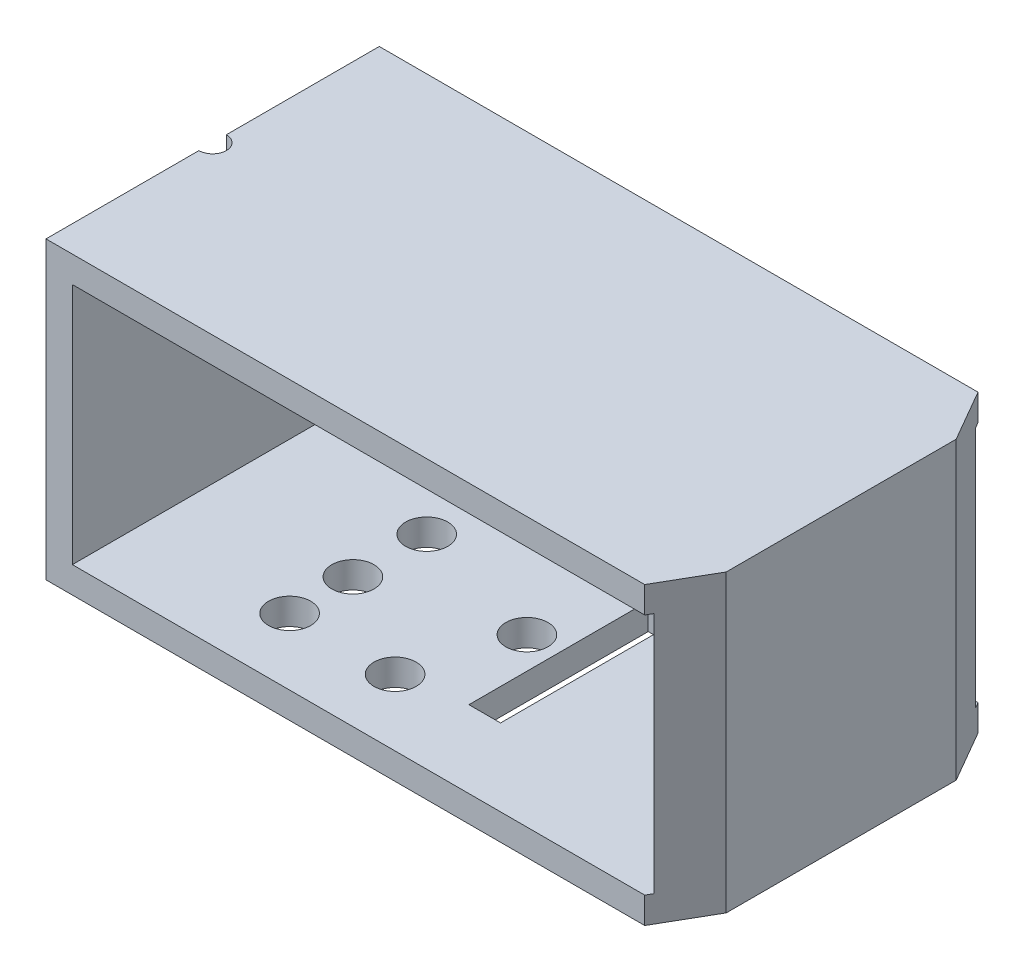
ISO-10303-21;
HEADER;
FILE_DESCRIPTION(('STEP AP214'),'2;1');
FILE_NAME('part.step','',(''),(''),'','','');
FILE_SCHEMA(('AUTOMOTIVE_DESIGN { 1 0 10303 214 1 1 1 1 }'));
ENDSEC;
DATA;
#1=APPLICATION_CONTEXT('core data for automotive mechanical design processes');
#2=APPLICATION_PROTOCOL_DEFINITION('international standard','automotive_design',2000,#1);
#3=PRODUCT_CONTEXT('',#1,'mechanical');
#4=PRODUCT('Part','Part','',(#3));
#5=PRODUCT_RELATED_PRODUCT_CATEGORY('part','',(#4));
#6=PRODUCT_DEFINITION_FORMATION('','',#4);
#7=PRODUCT_DEFINITION_CONTEXT('part definition',#1,'design');
#8=PRODUCT_DEFINITION('design','',#6,#7);
#9=PRODUCT_DEFINITION_SHAPE('','',#8);
#10=(LENGTH_UNIT() NAMED_UNIT(*) SI_UNIT(.MILLI.,.METRE.));
#11=(NAMED_UNIT(*) PLANE_ANGLE_UNIT() SI_UNIT($,.RADIAN.));
#12=(NAMED_UNIT(*) SI_UNIT($,.STERADIAN.) SOLID_ANGLE_UNIT());
#13=UNCERTAINTY_MEASURE_WITH_UNIT(LENGTH_MEASURE(1.E-05),#10,'distance_accuracy_value','');
#14=(GEOMETRIC_REPRESENTATION_CONTEXT(3) GLOBAL_UNCERTAINTY_ASSIGNED_CONTEXT((#13)) GLOBAL_UNIT_ASSIGNED_CONTEXT((#10,
#11,#12)) REPRESENTATION_CONTEXT('',''));
#15=CARTESIAN_POINT('',(0.,0.,0.));
#16=DIRECTION('',(0.,0.,1.));
#17=DIRECTION('',(1.,0.,0.));
#18=AXIS2_PLACEMENT_3D('',#15,#16,#17);
#19=CARTESIAN_POINT('',(-29.8,14.,15.8));
#20=DIRECTION('',(1.,0.,0.));
#21=DIRECTION('',(0.,0.,-1.));
#22=AXIS2_PLACEMENT_3D('',#19,#20,#21);
#23=PLANE('',#22);
#24=DIRECTION('',(0.,0.,-1.));
#25=VECTOR('',#24,1.);
#26=CARTESIAN_POINT('',(-29.8,-14.,15.8));
#27=LINE('',#26,#25);
#28=CARTESIAN_POINT('',(-29.8,-14.,-1.3));
#29=VERTEX_POINT('',#28);
#30=CARTESIAN_POINT('',(-29.8,-14.,-15.8));
#31=VERTEX_POINT('',#30);
#32=EDGE_CURVE('E290',#29,#31,#27,.T.);
#33=ORIENTED_EDGE('',*,*,#32,.F.);
#34=DIRECTION('',(0.,1.,0.));
#35=VECTOR('',#34,1.);
#36=CARTESIAN_POINT('',(-29.8,-14.,-1.3));
#37=LINE('',#36,#35);
#38=CARTESIAN_POINT('',(-29.8,14.,-1.3));
#39=VERTEX_POINT('',#38);
#40=EDGE_CURVE('E242',#29,#39,#37,.T.);
#41=ORIENTED_EDGE('',*,*,#40,.T.);
#42=DIRECTION('',(0.,0.,-1.));
#43=VECTOR('',#42,1.);
#44=CARTESIAN_POINT('',(-29.8,14.,15.8));
#45=LINE('',#44,#43);
#46=CARTESIAN_POINT('',(-29.8,14.,-15.8));
#47=VERTEX_POINT('',#46);
#48=EDGE_CURVE('E294',#39,#47,#45,.T.);
#49=ORIENTED_EDGE('',*,*,#48,.T.);
#50=DIRECTION('',(0.,-1.,0.));
#51=VECTOR('',#50,1.);
#52=CARTESIAN_POINT('',(-29.8,14.,-15.8));
#53=LINE('',#52,#51);
#54=EDGE_CURVE('E283',#47,#31,#53,.T.);
#55=ORIENTED_EDGE('',*,*,#54,.T.);
#56=EDGE_LOOP('',(#33,#41,#49,#55));
#57=FACE_BOUND('',#56,.T.);
#58=ADVANCED_FACE('F33',(#57),#23,.F.);
#59=CARTESIAN_POINT('',(0.,0.,15.8));
#60=DIRECTION('',(0.,0.,1.));
#61=DIRECTION('',(1.,0.,0.));
#62=AXIS2_PLACEMENT_3D('',#59,#60,#61);
#63=PLANE('',#62);
#64=DIRECTION('',(0.,1.,0.));
#65=VECTOR('',#64,1.);
#66=CARTESIAN_POINT('',(26.9709836809708,-14.,15.8));
#67=LINE('',#66,#65);
#68=CARTESIAN_POINT('',(26.9709836809708,11.5,15.8));
#69=VERTEX_POINT('',#68);
#70=CARTESIAN_POINT('',(26.9709836809708,14.,15.8));
#71=VERTEX_POINT('',#70);
#72=EDGE_CURVE('E215',#69,#71,#67,.T.);
#73=ORIENTED_EDGE('',*,*,#72,.T.);
#74=DIRECTION('',(-1.,0.,0.));
#75=VECTOR('',#74,1.);
#76=CARTESIAN_POINT('',(-29.8,14.,15.8));
#77=LINE('',#76,#75);
#78=CARTESIAN_POINT('',(-29.8,14.,15.8));
#79=VERTEX_POINT('',#78);
#80=EDGE_CURVE('E273',#71,#79,#77,.T.);
#81=ORIENTED_EDGE('',*,*,#80,.T.);
#82=DIRECTION('',(0.,-1.,0.));
#83=VECTOR('',#82,1.);
#84=CARTESIAN_POINT('',(-29.8,14.,15.8));
#85=LINE('',#84,#83);
#86=CARTESIAN_POINT('',(-29.8,-14.,15.8));
#87=VERTEX_POINT('',#86);
#88=EDGE_CURVE('E275',#79,#87,#85,.T.);
#89=ORIENTED_EDGE('',*,*,#88,.T.);
#90=DIRECTION('',(1.,0.,0.));
#91=VECTOR('',#90,1.);
#92=CARTESIAN_POINT('',(-29.8,-14.,15.8));
#93=LINE('',#92,#91);
#94=CARTESIAN_POINT('',(26.9709836809708,-14.,15.8));
#95=VERTEX_POINT('',#94);
#96=EDGE_CURVE('E278',#87,#95,#93,.T.);
#97=ORIENTED_EDGE('',*,*,#96,.T.);
#98=CARTESIAN_POINT('',(26.9709836809708,-11.5,15.8));
#99=VERTEX_POINT('',#98);
#100=EDGE_CURVE('E211',#95,#99,#67,.T.);
#101=ORIENTED_EDGE('',*,*,#100,.T.);
#102=DIRECTION('',(1.,0.,0.));
#103=VECTOR('',#102,1.);
#104=CARTESIAN_POINT('',(-27.3,-11.5,15.8));
#105=LINE('',#104,#103);
#106=CARTESIAN_POINT('',(-27.3,-11.5,15.8));
#107=VERTEX_POINT('',#106);
#108=EDGE_CURVE('E252',#107,#99,#105,.T.);
#109=ORIENTED_EDGE('',*,*,#108,.F.);
#110=DIRECTION('',(0.,-1.,0.));
#111=VECTOR('',#110,1.);
#112=CARTESIAN_POINT('',(-27.3,11.5,15.8));
#113=LINE('',#112,#111);
#114=CARTESIAN_POINT('',(-27.3,11.5,15.8));
#115=VERTEX_POINT('',#114);
#116=EDGE_CURVE('E248',#115,#107,#113,.T.);
#117=ORIENTED_EDGE('',*,*,#116,.F.);
#118=DIRECTION('',(-1.,0.,0.));
#119=VECTOR('',#118,1.);
#120=CARTESIAN_POINT('',(-27.3,11.5,15.8));
#121=LINE('',#120,#119);
#122=EDGE_CURVE('E246',#69,#115,#121,.T.);
#123=ORIENTED_EDGE('',*,*,#122,.F.);
#124=EDGE_LOOP('',(#73,#81,#89,#97,#101,#109,#117,#123));
#125=FACE_BOUND('',#124,.T.);
#126=ADVANCED_FACE('F375',(#125),#63,.T.);
#127=CARTESIAN_POINT('',(0.,0.,-15.8));
#128=DIRECTION('',(0.,0.,1.));
#129=DIRECTION('',(1.,0.,0.));
#130=AXIS2_PLACEMENT_3D('',#127,#128,#129);
#131=PLANE('',#130);
#132=DIRECTION('',(-1.,0.,0.));
#133=VECTOR('',#132,1.);
#134=CARTESIAN_POINT('',(-29.8,14.,-15.8));
#135=LINE('',#134,#133);
#136=CARTESIAN_POINT('',(26.9709836809708,14.,-15.8));
#137=VERTEX_POINT('',#136);
#138=EDGE_CURVE('E272',#137,#47,#135,.T.);
#139=ORIENTED_EDGE('',*,*,#138,.F.);
#140=DIRECTION('',(0.,1.,0.));
#141=VECTOR('',#140,1.);
#142=CARTESIAN_POINT('',(26.9709836809708,-14.,-15.8));
#143=LINE('',#142,#141);
#144=CARTESIAN_POINT('',(26.9709836809708,11.5,-15.8));
#145=VERTEX_POINT('',#144);
#146=EDGE_CURVE('E220',#145,#137,#143,.T.);
#147=ORIENTED_EDGE('',*,*,#146,.F.);
#148=DIRECTION('',(-1.,0.,0.));
#149=VECTOR('',#148,1.);
#150=CARTESIAN_POINT('',(-27.3,11.5,-15.8));
#151=LINE('',#150,#149);
#152=CARTESIAN_POINT('',(-27.3,11.5,-15.8));
#153=VERTEX_POINT('',#152);
#154=EDGE_CURVE('E245',#145,#153,#151,.T.);
#155=ORIENTED_EDGE('',*,*,#154,.T.);
#156=DIRECTION('',(0.,-1.,0.));
#157=VECTOR('',#156,1.);
#158=CARTESIAN_POINT('',(-27.3,11.5,-15.8));
#159=LINE('',#158,#157);
#160=CARTESIAN_POINT('',(-27.3,-11.5,-15.8));
#161=VERTEX_POINT('',#160);
#162=EDGE_CURVE('E257',#153,#161,#159,.T.);
#163=ORIENTED_EDGE('',*,*,#162,.T.);
#164=DIRECTION('',(1.,0.,0.));
#165=VECTOR('',#164,1.);
#166=CARTESIAN_POINT('',(-27.3,-11.5,-15.8));
#167=LINE('',#166,#165);
#168=CARTESIAN_POINT('',(26.9709836809708,-11.5,-15.8));
#169=VERTEX_POINT('',#168);
#170=EDGE_CURVE('E249',#161,#169,#167,.T.);
#171=ORIENTED_EDGE('',*,*,#170,.T.);
#172=CARTESIAN_POINT('',(26.9709836809708,-14.,-15.8));
#173=VERTEX_POINT('',#172);
#174=EDGE_CURVE('E225',#173,#169,#143,.T.);
#175=ORIENTED_EDGE('',*,*,#174,.F.);
#176=DIRECTION('',(1.,0.,0.));
#177=VECTOR('',#176,1.);
#178=CARTESIAN_POINT('',(-29.8,-14.,-15.8));
#179=LINE('',#178,#177);
#180=EDGE_CURVE('E276',#31,#173,#179,.T.);
#181=ORIENTED_EDGE('',*,*,#180,.F.);
#182=ORIENTED_EDGE('',*,*,#54,.F.);
#183=EDGE_LOOP('',(#139,#147,#155,#163,#171,#175,#181,#182));
#184=FACE_BOUND('',#183,.T.);
#185=ADVANCED_FACE('F406',(#184),#131,.F.);
#186=CARTESIAN_POINT('',(29.8,14.,15.8));
#187=DIRECTION('',(-1.,0.,0.));
#188=DIRECTION('',(0.,-1.,0.));
#189=AXIS2_PLACEMENT_3D('',#186,#187,#188);
#190=PLANE('',#189);
#191=DIRECTION('',(0.,0.,-1.));
#192=VECTOR('',#191,1.);
#193=CARTESIAN_POINT('',(29.8,14.,15.8));
#194=LINE('',#193,#192);
#195=CARTESIAN_POINT('',(29.8,14.,10.9));
#196=VERTEX_POINT('',#195);
#197=CARTESIAN_POINT('',(29.8,14.,-10.9));
#198=VERTEX_POINT('',#197);
#199=EDGE_CURVE('E298',#196,#198,#194,.T.);
#200=ORIENTED_EDGE('',*,*,#199,.F.);
#201=DIRECTION('',(0.,1.,0.));
#202=VECTOR('',#201,1.);
#203=CARTESIAN_POINT('',(29.8,-14.,10.9));
#204=LINE('',#203,#202);
#205=CARTESIAN_POINT('',(29.8,-14.,10.9));
#206=VERTEX_POINT('',#205);
#207=EDGE_CURVE('E207',#206,#196,#204,.T.);
#208=ORIENTED_EDGE('',*,*,#207,.F.);
#209=DIRECTION('',(0.,0.,-1.));
#210=VECTOR('',#209,1.);
#211=CARTESIAN_POINT('',(29.8,-14.,15.8));
#212=LINE('',#211,#210);
#213=CARTESIAN_POINT('',(29.8,-14.,-10.9));
#214=VERTEX_POINT('',#213);
#215=EDGE_CURVE('E281',#206,#214,#212,.T.);
#216=ORIENTED_EDGE('',*,*,#215,.T.);
#217=DIRECTION('',(0.,1.,0.));
#218=VECTOR('',#217,1.);
#219=CARTESIAN_POINT('',(29.8,-14.,-10.9));
#220=LINE('',#219,#218);
#221=EDGE_CURVE('E210',#214,#198,#220,.T.);
#222=ORIENTED_EDGE('',*,*,#221,.T.);
#223=EDGE_LOOP('',(#200,#208,#216,#222));
#224=FACE_BOUND('',#223,.T.);
#225=ADVANCED_FACE('F35',(#224),#190,.F.);
#226=CARTESIAN_POINT('',(-29.8,14.,15.8));
#227=DIRECTION('',(0.,-1.,0.));
#228=DIRECTION('',(1.,0.,0.));
#229=AXIS2_PLACEMENT_3D('',#226,#227,#228);
#230=PLANE('',#229);
#231=ORIENTED_EDGE('',*,*,#80,.F.);
#232=DIRECTION('',(-0.500000000000005,0.,0.866025403784436));
#233=VECTOR('',#232,1.);
#234=CARTESIAN_POINT('',(26.9709836809708,14.,15.8));
#235=LINE('',#234,#233);
#236=EDGE_CURVE('E208',#196,#71,#235,.T.);
#237=ORIENTED_EDGE('',*,*,#236,.F.);
#238=ORIENTED_EDGE('',*,*,#199,.T.);
#239=DIRECTION('',(0.500000000000005,0.,0.866025403784436));
#240=VECTOR('',#239,1.);
#241=CARTESIAN_POINT('',(26.9709836809708,14.,-15.8));
#242=LINE('',#241,#240);
#243=EDGE_CURVE('E221',#137,#198,#242,.T.);
#244=ORIENTED_EDGE('',*,*,#243,.F.);
#245=ORIENTED_EDGE('',*,*,#138,.T.);
#246=ORIENTED_EDGE('',*,*,#48,.F.);
#247=CARTESIAN_POINT('',(-29.8,14.,0.));
#248=DIRECTION('',(0.,1.,0.));
#249=DIRECTION('',(-1.,0.,0.));
#250=AXIS2_PLACEMENT_3D('',#247,#248,#249);
#251=CIRCLE('',#250,1.3);
#252=CARTESIAN_POINT('',(-29.8,14.,1.3));
#253=VERTEX_POINT('',#252);
#254=EDGE_CURVE('E234',#253,#39,#251,.T.);
#255=ORIENTED_EDGE('',*,*,#254,.F.);
#256=EDGE_CURVE('E295',#79,#253,#45,.T.);
#257=ORIENTED_EDGE('',*,*,#256,.F.);
#258=EDGE_LOOP('',(#231,#237,#238,#244,#245,#246,#255,#257));
#259=FACE_BOUND('',#258,.T.);
#260=ADVANCED_FACE('F369',(#259),#230,.F.);
#261=ORIENTED_EDGE('',*,*,#256,.T.);
#262=DIRECTION('',(0.,1.,0.));
#263=VECTOR('',#262,1.);
#264=CARTESIAN_POINT('',(-29.8,-14.,1.3));
#265=LINE('',#264,#263);
#266=CARTESIAN_POINT('',(-29.8,-14.,1.3));
#267=VERTEX_POINT('',#266);
#268=EDGE_CURVE('E238',#253,#267,#265,.F.);
#269=ORIENTED_EDGE('',*,*,#268,.T.);
#270=EDGE_CURVE('E291',#87,#267,#27,.T.);
#271=ORIENTED_EDGE('',*,*,#270,.F.);
#272=ORIENTED_EDGE('',*,*,#88,.F.);
#273=EDGE_LOOP('',(#261,#269,#271,#272));
#274=FACE_BOUND('',#273,.T.);
#275=ADVANCED_FACE('F346',(#274),#23,.F.);
#276=CARTESIAN_POINT('',(-29.8,-14.,15.8));
#277=DIRECTION('',(0.,1.,0.));
#278=DIRECTION('',(0.,0.,1.));
#279=AXIS2_PLACEMENT_3D('',#276,#277,#278);
#280=PLANE('',#279);
#281=DIRECTION('',(-1.,0.,0.));
#282=VECTOR('',#281,1.);
#283=CARTESIAN_POINT('',(3.,-14.,8.5));
#284=LINE('',#283,#282);
#285=CARTESIAN_POINT('',(6.,-14.,8.5));
#286=VERTEX_POINT('',#285);
#287=CARTESIAN_POINT('',(3.,-14.,8.5));
#288=VERTEX_POINT('',#287);
#289=EDGE_CURVE('E169',#286,#288,#284,.T.);
#290=ORIENTED_EDGE('',*,*,#289,.F.);
#291=DIRECTION('',(0.,0.,1.));
#292=VECTOR('',#291,1.);
#293=CARTESIAN_POINT('',(6.,-14.,8.5));
#294=LINE('',#293,#292);
#295=CARTESIAN_POINT('',(6.,-14.,-8.5));
#296=VERTEX_POINT('',#295);
#297=EDGE_CURVE('E48',#296,#286,#294,.T.);
#298=ORIENTED_EDGE('',*,*,#297,.F.);
#299=DIRECTION('',(1.,0.,0.));
#300=VECTOR('',#299,1.);
#301=CARTESIAN_POINT('',(3.,-14.,-8.5));
#302=LINE('',#301,#300);
#303=CARTESIAN_POINT('',(3.,-14.,-8.5));
#304=VERTEX_POINT('',#303);
#305=EDGE_CURVE('E176',#304,#296,#302,.T.);
#306=ORIENTED_EDGE('',*,*,#305,.F.);
#307=DIRECTION('',(0.,0.,-1.));
#308=VECTOR('',#307,1.);
#309=CARTESIAN_POINT('',(3.,-14.,8.5));
#310=LINE('',#309,#308);
#311=EDGE_CURVE('E160',#288,#304,#310,.T.);
#312=ORIENTED_EDGE('',*,*,#311,.F.);
#313=EDGE_LOOP('',(#290,#298,#306,#312));
#314=FACE_BOUND('',#313,.T.);
#315=CARTESIAN_POINT('',(-13.,-14.,-3.5));
#316=DIRECTION('',(0.,-1.,0.));
#317=DIRECTION('',(0.,0.,1.));
#318=AXIS2_PLACEMENT_3D('',#315,#316,#317);
#319=CIRCLE('',#318,2.);
#320=CARTESIAN_POINT('',(-13.,-14.,-1.5));
#321=VERTEX_POINT('',#320);
#322=EDGE_CURVE('E186',#321,#321,#319,.T.);
#323=ORIENTED_EDGE('',*,*,#322,.F.);
#324=EDGE_LOOP('',(#323));
#325=FACE_BOUND('',#324,.T.);
#326=CARTESIAN_POINT('',(-13.,-14.,-9.49999999999999));
#327=DIRECTION('',(0.,-1.,0.));
#328=DIRECTION('',(0.,0.,1.));
#329=AXIS2_PLACEMENT_3D('',#326,#327,#328);
#330=CIRCLE('',#329,2.);
#331=CARTESIAN_POINT('',(-13.,-14.,-7.49999999999999));
#332=VERTEX_POINT('',#331);
#333=EDGE_CURVE('E189',#332,#332,#330,.T.);
#334=ORIENTED_EDGE('',*,*,#333,.F.);
#335=EDGE_LOOP('',(#334));
#336=FACE_BOUND('',#335,.T.);
#337=CARTESIAN_POINT('',(-3.,-14.,-9.5));
#338=DIRECTION('',(0.,-1.,0.));
#339=DIRECTION('',(0.,0.,1.));
#340=AXIS2_PLACEMENT_3D('',#337,#338,#339);
#341=CIRCLE('',#340,2.);
#342=CARTESIAN_POINT('',(-3.,-14.,-7.5));
#343=VERTEX_POINT('',#342);
#344=EDGE_CURVE('E335',#343,#343,#341,.T.);
#345=ORIENTED_EDGE('',*,*,#344,.F.);
#346=EDGE_LOOP('',(#345));
#347=FACE_BOUND('',#346,.T.);
#348=CARTESIAN_POINT('',(-13.,-14.,3.5));
#349=DIRECTION('',(0.,-1.,0.));
#350=DIRECTION('',(0.,0.,-1.));
#351=AXIS2_PLACEMENT_3D('',#348,#349,#350);
#352=CIRCLE('',#351,2.);
#353=CARTESIAN_POINT('',(-13.,-14.,1.5));
#354=VERTEX_POINT('',#353);
#355=EDGE_CURVE('E183',#354,#354,#352,.T.);
#356=ORIENTED_EDGE('',*,*,#355,.F.);
#357=EDGE_LOOP('',(#356));
#358=FACE_BOUND('',#357,.T.);
#359=CARTESIAN_POINT('',(-13.,-14.,9.49999999999999));
#360=DIRECTION('',(0.,-1.,0.));
#361=DIRECTION('',(0.,0.,-1.));
#362=AXIS2_PLACEMENT_3D('',#359,#360,#361);
#363=CIRCLE('',#362,2.);
#364=CARTESIAN_POINT('',(-13.,-14.,7.49999999999999));
#365=VERTEX_POINT('',#364);
#366=EDGE_CURVE('E194',#365,#365,#363,.T.);
#367=ORIENTED_EDGE('',*,*,#366,.F.);
#368=EDGE_LOOP('',(#367));
#369=FACE_BOUND('',#368,.T.);
#370=CARTESIAN_POINT('',(-3.,-14.,9.5));
#371=DIRECTION('',(0.,-1.,0.));
#372=DIRECTION('',(0.,0.,-1.));
#373=AXIS2_PLACEMENT_3D('',#370,#371,#372);
#374=CIRCLE('',#373,2.);
#375=CARTESIAN_POINT('',(-3.,-14.,7.5));
#376=VERTEX_POINT('',#375);
#377=EDGE_CURVE('E190',#376,#376,#374,.T.);
#378=ORIENTED_EDGE('',*,*,#377,.F.);
#379=EDGE_LOOP('',(#378));
#380=FACE_BOUND('',#379,.T.);
#381=CARTESIAN_POINT('',(0.,-14.,0.));
#382=DIRECTION('',(0.,-1.,0.));
#383=DIRECTION('',(0.,0.,-1.));
#384=AXIS2_PLACEMENT_3D('',#381,#382,#383);
#385=CIRCLE('',#384,2.);
#386=CARTESIAN_POINT('',(0.,-14.,-2.));
#387=VERTEX_POINT('',#386);
#388=EDGE_CURVE('E199',#387,#387,#385,.T.);
#389=ORIENTED_EDGE('',*,*,#388,.F.);
#390=EDGE_LOOP('',(#389));
#391=FACE_BOUND('',#390,.T.);
#392=ORIENTED_EDGE('',*,*,#215,.F.);
#393=DIRECTION('',(-0.500000000000005,0.,0.866025403784436));
#394=VECTOR('',#393,1.);
#395=CARTESIAN_POINT('',(26.9709836809708,-14.,15.8));
#396=LINE('',#395,#394);
#397=EDGE_CURVE('E204',#206,#95,#396,.T.);
#398=ORIENTED_EDGE('',*,*,#397,.T.);
#399=ORIENTED_EDGE('',*,*,#96,.F.);
#400=ORIENTED_EDGE('',*,*,#270,.T.);
#401=CARTESIAN_POINT('',(-29.8,-14.,0.));
#402=DIRECTION('',(0.,1.,0.));
#403=DIRECTION('',(-1.,0.,0.));
#404=AXIS2_PLACEMENT_3D('',#401,#402,#403);
#405=CIRCLE('',#404,1.3);
#406=EDGE_CURVE('E235',#267,#29,#405,.T.);
#407=ORIENTED_EDGE('',*,*,#406,.T.);
#408=ORIENTED_EDGE('',*,*,#32,.T.);
#409=ORIENTED_EDGE('',*,*,#180,.T.);
#410=DIRECTION('',(0.500000000000005,0.,0.866025403784436));
#411=VECTOR('',#410,1.);
#412=CARTESIAN_POINT('',(26.9709836809708,-14.,-15.8));
#413=LINE('',#412,#411);
#414=EDGE_CURVE('E217',#173,#214,#413,.T.);
#415=ORIENTED_EDGE('',*,*,#414,.T.);
#416=EDGE_LOOP('',(#392,#398,#399,#400,#407,#408,#409,#415));
#417=FACE_BOUND('',#416,.T.);
#418=ADVANCED_FACE('F173',(#314,#325,#336,#347,#358,#369,#380,#391,#417),#280,.F.);
#419=CARTESIAN_POINT('',(27.3,11.5,15.8));
#420=DIRECTION('',(-1.,0.,0.));
#421=DIRECTION('',(0.,0.,1.));
#422=AXIS2_PLACEMENT_3D('',#419,#420,#421);
#423=PLANE('',#422);
#424=DIRECTION('',(0.,-1.,0.));
#425=VECTOR('',#424,1.);
#426=CARTESIAN_POINT('',(27.3,11.5,15.2301270189222));
#427=LINE('',#426,#425);
#428=CARTESIAN_POINT('',(27.3,11.5,15.2301270189222));
#429=VERTEX_POINT('',#428);
#430=CARTESIAN_POINT('',(27.3,-11.5,15.2301270189221));
#431=VERTEX_POINT('',#430);
#432=EDGE_CURVE('E230',#429,#431,#427,.T.);
#433=ORIENTED_EDGE('',*,*,#432,.F.);
#434=DIRECTION('',(0.,0.,-1.));
#435=VECTOR('',#434,1.);
#436=CARTESIAN_POINT('',(27.3,11.5,15.8));
#437=LINE('',#436,#435);
#438=CARTESIAN_POINT('',(27.3,11.5,-15.2301270189221));
#439=VERTEX_POINT('',#438);
#440=EDGE_CURVE('E269',#429,#439,#437,.T.);
#441=ORIENTED_EDGE('',*,*,#440,.T.);
#442=DIRECTION('',(0.,1.,0.));
#443=VECTOR('',#442,1.);
#444=CARTESIAN_POINT('',(27.3,11.5,-15.2301270189221));
#445=LINE('',#444,#443);
#446=CARTESIAN_POINT('',(27.3,-11.5,-15.2301270189222));
#447=VERTEX_POINT('',#446);
#448=EDGE_CURVE('E214',#447,#439,#445,.T.);
#449=ORIENTED_EDGE('',*,*,#448,.F.);
#450=DIRECTION('',(0.,0.,-1.));
#451=VECTOR('',#450,1.);
#452=CARTESIAN_POINT('',(27.3,-11.5,15.8));
#453=LINE('',#452,#451);
#454=EDGE_CURVE('E255',#431,#447,#453,.T.);
#455=ORIENTED_EDGE('',*,*,#454,.F.);
#456=EDGE_LOOP('',(#433,#441,#449,#455));
#457=FACE_BOUND('',#456,.T.);
#458=ADVANCED_FACE('F345',(#457),#423,.T.);
#459=CARTESIAN_POINT('',(-27.3,11.5,15.8));
#460=DIRECTION('',(0.,-1.,0.));
#461=DIRECTION('',(0.,0.,-1.));
#462=AXIS2_PLACEMENT_3D('',#459,#460,#461);
#463=PLANE('',#462);
#464=DIRECTION('',(0.500000000000005,0.,-0.866025403784436));
#465=VECTOR('',#464,1.);
#466=CARTESIAN_POINT('',(13.4032377607278,11.5,39.3000252780459));
#467=LINE('',#466,#465);
#468=EDGE_CURVE('E232',#69,#429,#467,.T.);
#469=ORIENTED_EDGE('',*,*,#468,.F.);
#470=ORIENTED_EDGE('',*,*,#122,.T.);
#471=DIRECTION('',(0.,0.,-1.));
#472=VECTOR('',#471,1.);
#473=CARTESIAN_POINT('',(-27.3,11.5,15.8));
#474=LINE('',#473,#472);
#475=EDGE_CURVE('E266',#115,#153,#474,.T.);
#476=ORIENTED_EDGE('',*,*,#475,.T.);
#477=ORIENTED_EDGE('',*,*,#154,.F.);
#478=DIRECTION('',(-0.500000000000005,0.,-0.866025403784436));
#479=VECTOR('',#478,1.);
#480=CARTESIAN_POINT('',(27.0864391405221,11.5,-15.600025278046));
#481=LINE('',#480,#479);
#482=EDGE_CURVE('E228',#439,#145,#481,.T.);
#483=ORIENTED_EDGE('',*,*,#482,.F.);
#484=ORIENTED_EDGE('',*,*,#440,.F.);
#485=EDGE_LOOP('',(#469,#470,#476,#477,#483,#484));
#486=FACE_BOUND('',#485,.T.);
#487=ADVANCED_FACE('F383',(#486),#463,.T.);
#488=CARTESIAN_POINT('',(-27.3,11.5,15.8));
#489=DIRECTION('',(1.,0.,0.));
#490=DIRECTION('',(0.,1.,0.));
#491=AXIS2_PLACEMENT_3D('',#488,#489,#490);
#492=PLANE('',#491);
#493=ORIENTED_EDGE('',*,*,#162,.F.);
#494=ORIENTED_EDGE('',*,*,#475,.F.);
#495=ORIENTED_EDGE('',*,*,#116,.T.);
#496=DIRECTION('',(0.,0.,-1.));
#497=VECTOR('',#496,1.);
#498=CARTESIAN_POINT('',(-27.3,-11.5,15.8));
#499=LINE('',#498,#497);
#500=EDGE_CURVE('E264',#107,#161,#499,.T.);
#501=ORIENTED_EDGE('',*,*,#500,.T.);
#502=EDGE_LOOP('',(#493,#494,#495,#501));
#503=FACE_BOUND('',#502,.T.);
#504=ADVANCED_FACE('F413',(#503),#492,.T.);
#505=CARTESIAN_POINT('',(-27.3,-11.5,15.8));
#506=DIRECTION('',(0.,1.,0.));
#507=DIRECTION('',(0.,0.,1.));
#508=AXIS2_PLACEMENT_3D('',#505,#506,#507);
#509=PLANE('',#508);
#510=DIRECTION('',(0.,0.,-1.));
#511=VECTOR('',#510,1.);
#512=CARTESIAN_POINT('',(6.00000000000001,-11.5,15.8));
#513=LINE('',#512,#511);
#514=CARTESIAN_POINT('',(6.,-11.5,8.5));
#515=VERTEX_POINT('',#514);
#516=CARTESIAN_POINT('',(6.,-11.5,-8.5));
#517=VERTEX_POINT('',#516);
#518=EDGE_CURVE('E11',#515,#517,#513,.T.);
#519=ORIENTED_EDGE('',*,*,#518,.F.);
#520=DIRECTION('',(1.,0.,0.));
#521=VECTOR('',#520,1.);
#522=CARTESIAN_POINT('',(-27.3,-11.5,8.5));
#523=LINE('',#522,#521);
#524=CARTESIAN_POINT('',(3.,-11.5,8.5));
#525=VERTEX_POINT('',#524);
#526=EDGE_CURVE('E305',#525,#515,#523,.T.);
#527=ORIENTED_EDGE('',*,*,#526,.F.);
#528=DIRECTION('',(0.,0.,1.));
#529=VECTOR('',#528,1.);
#530=CARTESIAN_POINT('',(3.,-11.5,15.8));
#531=LINE('',#530,#529);
#532=CARTESIAN_POINT('',(3.,-11.5,-8.5));
#533=VERTEX_POINT('',#532);
#534=EDGE_CURVE('E163',#533,#525,#531,.T.);
#535=ORIENTED_EDGE('',*,*,#534,.F.);
#536=DIRECTION('',(-1.,0.,0.));
#537=VECTOR('',#536,1.);
#538=CARTESIAN_POINT('',(-27.3,-11.5,-8.5));
#539=LINE('',#538,#537);
#540=EDGE_CURVE('E41',#517,#533,#539,.T.);
#541=ORIENTED_EDGE('',*,*,#540,.F.);
#542=EDGE_LOOP('',(#519,#527,#535,#541));
#543=FACE_BOUND('',#542,.T.);
#544=CARTESIAN_POINT('',(-13.,-11.5,-3.5));
#545=DIRECTION('',(0.,1.,0.));
#546=DIRECTION('',(0.,0.,1.));
#547=AXIS2_PLACEMENT_3D('',#544,#545,#546);
#548=CIRCLE('',#547,2.);
#549=CARTESIAN_POINT('',(-13.,-11.5,-1.5));
#550=VERTEX_POINT('',#549);
#551=EDGE_CURVE('E203',#550,#550,#548,.T.);
#552=ORIENTED_EDGE('',*,*,#551,.F.);
#553=EDGE_LOOP('',(#552));
#554=FACE_BOUND('',#553,.T.);
#555=CARTESIAN_POINT('',(-13.,-11.5,-9.49999999999999));
#556=DIRECTION('',(0.,1.,0.));
#557=DIRECTION('',(0.,0.,1.));
#558=AXIS2_PLACEMENT_3D('',#555,#556,#557);
#559=CIRCLE('',#558,2.);
#560=CARTESIAN_POINT('',(-13.,-11.5,-7.49999999999999));
#561=VERTEX_POINT('',#560);
#562=EDGE_CURVE('E319',#561,#561,#559,.T.);
#563=ORIENTED_EDGE('',*,*,#562,.F.);
#564=EDGE_LOOP('',(#563));
#565=FACE_BOUND('',#564,.T.);
#566=CARTESIAN_POINT('',(-3.,-11.5,-9.5));
#567=DIRECTION('',(0.,1.,0.));
#568=DIRECTION('',(0.,0.,1.));
#569=AXIS2_PLACEMENT_3D('',#566,#567,#568);
#570=CIRCLE('',#569,2.);
#571=CARTESIAN_POINT('',(-3.,-11.5,-7.5));
#572=VERTEX_POINT('',#571);
#573=EDGE_CURVE('E316',#572,#572,#570,.T.);
#574=ORIENTED_EDGE('',*,*,#573,.F.);
#575=EDGE_LOOP('',(#574));
#576=FACE_BOUND('',#575,.T.);
#577=CARTESIAN_POINT('',(-13.,-11.5,3.5));
#578=DIRECTION('',(0.,1.,0.));
#579=DIRECTION('',(0.,0.,1.));
#580=AXIS2_PLACEMENT_3D('',#577,#578,#579);
#581=CIRCLE('',#580,2.);
#582=CARTESIAN_POINT('',(-13.,-11.5,5.5));
#583=VERTEX_POINT('',#582);
#584=EDGE_CURVE('E313',#583,#583,#581,.T.);
#585=ORIENTED_EDGE('',*,*,#584,.F.);
#586=EDGE_LOOP('',(#585));
#587=FACE_BOUND('',#586,.T.);
#588=CARTESIAN_POINT('',(-13.,-11.5,9.49999999999999));
#589=DIRECTION('',(0.,1.,0.));
#590=DIRECTION('',(0.,0.,1.));
#591=AXIS2_PLACEMENT_3D('',#588,#589,#590);
#592=CIRCLE('',#591,2.);
#593=CARTESIAN_POINT('',(-13.,-11.5,11.5));
#594=VERTEX_POINT('',#593);
#595=EDGE_CURVE('E310',#594,#594,#592,.T.);
#596=ORIENTED_EDGE('',*,*,#595,.F.);
#597=EDGE_LOOP('',(#596));
#598=FACE_BOUND('',#597,.T.);
#599=CARTESIAN_POINT('',(-3.,-11.5,9.5));
#600=DIRECTION('',(0.,1.,0.));
#601=DIRECTION('',(0.,0.,1.));
#602=AXIS2_PLACEMENT_3D('',#599,#600,#601);
#603=CIRCLE('',#602,2.);
#604=CARTESIAN_POINT('',(-3.,-11.5,11.5));
#605=VERTEX_POINT('',#604);
#606=EDGE_CURVE('E193',#605,#605,#603,.T.);
#607=ORIENTED_EDGE('',*,*,#606,.F.);
#608=EDGE_LOOP('',(#607));
#609=FACE_BOUND('',#608,.T.);
#610=CARTESIAN_POINT('',(0.,-11.5,0.));
#611=DIRECTION('',(0.,1.,0.));
#612=DIRECTION('',(0.,0.,1.));
#613=AXIS2_PLACEMENT_3D('',#610,#611,#612);
#614=CIRCLE('',#613,2.);
#615=CARTESIAN_POINT('',(0.,-11.5,2.));
#616=VERTEX_POINT('',#615);
#617=EDGE_CURVE('E202',#616,#616,#614,.T.);
#618=ORIENTED_EDGE('',*,*,#617,.F.);
#619=EDGE_LOOP('',(#618));
#620=FACE_BOUND('',#619,.T.);
#621=DIRECTION('',(-0.500000000000005,0.,0.866025403784436));
#622=VECTOR('',#621,1.);
#623=CARTESIAN_POINT('',(13.4032377607278,-11.5,39.3000252780459));
#624=LINE('',#623,#622);
#625=EDGE_CURVE('E303',#431,#99,#624,.T.);
#626=ORIENTED_EDGE('',*,*,#625,.F.);
#627=ORIENTED_EDGE('',*,*,#454,.T.);
#628=DIRECTION('',(0.500000000000005,0.,0.866025403784436));
#629=VECTOR('',#628,1.);
#630=CARTESIAN_POINT('',(27.0864391405221,-11.5,-15.600025278046));
#631=LINE('',#630,#629);
#632=EDGE_CURVE('E301',#169,#447,#631,.T.);
#633=ORIENTED_EDGE('',*,*,#632,.F.);
#634=ORIENTED_EDGE('',*,*,#170,.F.);
#635=ORIENTED_EDGE('',*,*,#500,.F.);
#636=ORIENTED_EDGE('',*,*,#108,.T.);
#637=EDGE_LOOP('',(#626,#627,#633,#634,#635,#636));
#638=FACE_BOUND('',#637,.T.);
#639=ADVANCED_FACE('F331',(#543,#554,#565,#576,#587,#598,#609,#620,#638),#509,.T.);
#640=CARTESIAN_POINT('',(-29.8,-14.,0.));
#641=DIRECTION('',(0.,1.,0.));
#642=DIRECTION('',(-1.,0.,0.));
#643=AXIS2_PLACEMENT_3D('',#640,#641,#642);
#644=CYLINDRICAL_SURFACE('',#643,1.3);
#645=ORIENTED_EDGE('',*,*,#406,.F.);
#646=ORIENTED_EDGE('',*,*,#268,.F.);
#647=ORIENTED_EDGE('',*,*,#254,.T.);
#648=ORIENTED_EDGE('',*,*,#40,.F.);
#649=EDGE_LOOP('',(#645,#646,#647,#648));
#650=FACE_BOUND('',#649,.T.);
#651=ADVANCED_FACE('F398',(#650),#644,.F.);
#652=CARTESIAN_POINT('',(26.9709836809708,-14.,-15.8));
#653=DIRECTION('',(-0.866025403784436,0.,0.500000000000005));
#654=DIRECTION('',(0.500000000000005,0.,0.866025403784436));
#655=AXIS2_PLACEMENT_3D('',#652,#653,#654);
#656=PLANE('',#655);
#657=ORIENTED_EDGE('',*,*,#482,.T.);
#658=ORIENTED_EDGE('',*,*,#146,.T.);
#659=ORIENTED_EDGE('',*,*,#243,.T.);
#660=ORIENTED_EDGE('',*,*,#221,.F.);
#661=ORIENTED_EDGE('',*,*,#414,.F.);
#662=ORIENTED_EDGE('',*,*,#174,.T.);
#663=ORIENTED_EDGE('',*,*,#632,.T.);
#664=ORIENTED_EDGE('',*,*,#448,.T.);
#665=EDGE_LOOP('',(#657,#658,#659,#660,#661,#662,#663,#664));
#666=FACE_BOUND('',#665,.T.);
#667=ADVANCED_FACE('F410',(#666),#656,.F.);
#668=CARTESIAN_POINT('',(26.9709836809708,-14.,15.8));
#669=DIRECTION('',(-0.866025403784436,0.,-0.500000000000005));
#670=DIRECTION('',(-0.500000000000005,0.,0.866025403784436));
#671=AXIS2_PLACEMENT_3D('',#668,#669,#670);
#672=PLANE('',#671);
#673=ORIENTED_EDGE('',*,*,#468,.T.);
#674=ORIENTED_EDGE('',*,*,#432,.T.);
#675=ORIENTED_EDGE('',*,*,#625,.T.);
#676=ORIENTED_EDGE('',*,*,#100,.F.);
#677=ORIENTED_EDGE('',*,*,#397,.F.);
#678=ORIENTED_EDGE('',*,*,#207,.T.);
#679=ORIENTED_EDGE('',*,*,#236,.T.);
#680=ORIENTED_EDGE('',*,*,#72,.F.);
#681=EDGE_LOOP('',(#673,#674,#675,#676,#677,#678,#679,#680));
#682=FACE_BOUND('',#681,.T.);
#683=ADVANCED_FACE('F365',(#682),#672,.F.);
#684=CARTESIAN_POINT('',(0.,-10.4,0.));
#685=DIRECTION('',(0.,-1.,0.));
#686=DIRECTION('',(0.,0.,-1.));
#687=AXIS2_PLACEMENT_3D('',#684,#685,#686);
#688=CYLINDRICAL_SURFACE('',#687,2.);
#689=ORIENTED_EDGE('',*,*,#617,.T.);
#690=EDGE_LOOP('',(#689));
#691=FACE_BOUND('',#690,.T.);
#692=ORIENTED_EDGE('',*,*,#388,.T.);
#693=EDGE_LOOP('',(#692));
#694=FACE_BOUND('',#693,.T.);
#695=ADVANCED_FACE('F477',(#691,#694),#688,.F.);
#696=CARTESIAN_POINT('',(-3.,-10.4,9.5));
#697=DIRECTION('',(0.,-1.,0.));
#698=DIRECTION('',(0.,0.,-1.));
#699=AXIS2_PLACEMENT_3D('',#696,#697,#698);
#700=CYLINDRICAL_SURFACE('',#699,2.);
#701=ORIENTED_EDGE('',*,*,#606,.T.);
#702=EDGE_LOOP('',(#701));
#703=FACE_BOUND('',#702,.T.);
#704=ORIENTED_EDGE('',*,*,#377,.T.);
#705=EDGE_LOOP('',(#704));
#706=FACE_BOUND('',#705,.T.);
#707=ADVANCED_FACE('F498',(#703,#706),#700,.F.);
#708=CARTESIAN_POINT('',(-13.,-10.4,9.49999999999999));
#709=DIRECTION('',(0.,-1.,0.));
#710=DIRECTION('',(0.,0.,-1.));
#711=AXIS2_PLACEMENT_3D('',#708,#709,#710);
#712=CYLINDRICAL_SURFACE('',#711,2.);
#713=ORIENTED_EDGE('',*,*,#595,.T.);
#714=EDGE_LOOP('',(#713));
#715=FACE_BOUND('',#714,.T.);
#716=ORIENTED_EDGE('',*,*,#366,.T.);
#717=EDGE_LOOP('',(#716));
#718=FACE_BOUND('',#717,.T.);
#719=ADVANCED_FACE('F508',(#715,#718),#712,.F.);
#720=CARTESIAN_POINT('',(-13.,-10.4,3.5));
#721=DIRECTION('',(0.,-1.,0.));
#722=DIRECTION('',(0.,0.,-1.));
#723=AXIS2_PLACEMENT_3D('',#720,#721,#722);
#724=CYLINDRICAL_SURFACE('',#723,2.);
#725=ORIENTED_EDGE('',*,*,#584,.T.);
#726=EDGE_LOOP('',(#725));
#727=FACE_BOUND('',#726,.T.);
#728=ORIENTED_EDGE('',*,*,#355,.T.);
#729=EDGE_LOOP('',(#728));
#730=FACE_BOUND('',#729,.T.);
#731=ADVANCED_FACE('F518',(#727,#730),#724,.F.);
#732=CARTESIAN_POINT('',(-3.,-10.4,-9.5));
#733=DIRECTION('',(0.,-1.,0.));
#734=DIRECTION('',(0.,0.,-1.));
#735=AXIS2_PLACEMENT_3D('',#732,#733,#734);
#736=CYLINDRICAL_SURFACE('',#735,2.);
#737=ORIENTED_EDGE('',*,*,#573,.T.);
#738=EDGE_LOOP('',(#737));
#739=FACE_BOUND('',#738,.T.);
#740=ORIENTED_EDGE('',*,*,#344,.T.);
#741=EDGE_LOOP('',(#740));
#742=FACE_BOUND('',#741,.T.);
#743=ADVANCED_FACE('F528',(#739,#742),#736,.F.);
#744=CARTESIAN_POINT('',(-13.,-10.4,-9.49999999999999));
#745=DIRECTION('',(0.,-1.,0.));
#746=DIRECTION('',(0.,0.,-1.));
#747=AXIS2_PLACEMENT_3D('',#744,#745,#746);
#748=CYLINDRICAL_SURFACE('',#747,2.);
#749=ORIENTED_EDGE('',*,*,#562,.T.);
#750=EDGE_LOOP('',(#749));
#751=FACE_BOUND('',#750,.T.);
#752=ORIENTED_EDGE('',*,*,#333,.T.);
#753=EDGE_LOOP('',(#752));
#754=FACE_BOUND('',#753,.T.);
#755=ADVANCED_FACE('F341',(#751,#754),#748,.F.);
#756=CARTESIAN_POINT('',(-13.,-10.4,-3.5));
#757=DIRECTION('',(0.,-1.,0.));
#758=DIRECTION('',(0.,0.,-1.));
#759=AXIS2_PLACEMENT_3D('',#756,#757,#758);
#760=CYLINDRICAL_SURFACE('',#759,2.);
#761=ORIENTED_EDGE('',*,*,#551,.T.);
#762=EDGE_LOOP('',(#761));
#763=FACE_BOUND('',#762,.T.);
#764=ORIENTED_EDGE('',*,*,#322,.T.);
#765=EDGE_LOOP('',(#764));
#766=FACE_BOUND('',#765,.T.);
#767=ADVANCED_FACE('F547',(#763,#766),#760,.F.);
#768=CARTESIAN_POINT('',(6.,-10.4,8.5));
#769=DIRECTION('',(1.,0.,0.));
#770=DIRECTION('',(0.,0.,-1.));
#771=AXIS2_PLACEMENT_3D('',#768,#769,#770);
#772=PLANE('',#771);
#773=ORIENTED_EDGE('',*,*,#518,.T.);
#774=DIRECTION('',(0.,-1.,0.));
#775=VECTOR('',#774,1.);
#776=CARTESIAN_POINT('',(6.,-10.4,-8.5));
#777=LINE('',#776,#775);
#778=EDGE_CURVE('E181',#517,#296,#777,.T.);
#779=ORIENTED_EDGE('',*,*,#778,.T.);
#780=ORIENTED_EDGE('',*,*,#297,.T.);
#781=DIRECTION('',(0.,-1.,0.));
#782=VECTOR('',#781,1.);
#783=CARTESIAN_POINT('',(6.,-10.4,8.5));
#784=LINE('',#783,#782);
#785=EDGE_CURVE('E166',#515,#286,#784,.T.);
#786=ORIENTED_EDGE('',*,*,#785,.F.);
#787=EDGE_LOOP('',(#773,#779,#780,#786));
#788=FACE_BOUND('',#787,.T.);
#789=ADVANCED_FACE('F333',(#788),#772,.F.);
#790=CARTESIAN_POINT('',(3.,-10.4,-8.5));
#791=DIRECTION('',(0.,0.,-1.));
#792=DIRECTION('',(-1.,0.,0.));
#793=AXIS2_PLACEMENT_3D('',#790,#791,#792);
#794=PLANE('',#793);
#795=ORIENTED_EDGE('',*,*,#540,.T.);
#796=DIRECTION('',(0.,-1.,0.));
#797=VECTOR('',#796,1.);
#798=CARTESIAN_POINT('',(3.,-10.4,-8.5));
#799=LINE('',#798,#797);
#800=EDGE_CURVE('E165',#533,#304,#799,.T.);
#801=ORIENTED_EDGE('',*,*,#800,.T.);
#802=ORIENTED_EDGE('',*,*,#305,.T.);
#803=ORIENTED_EDGE('',*,*,#778,.F.);
#804=EDGE_LOOP('',(#795,#801,#802,#803));
#805=FACE_BOUND('',#804,.T.);
#806=ADVANCED_FACE('F328',(#805),#794,.F.);
#807=CARTESIAN_POINT('',(3.,-10.4,8.5));
#808=DIRECTION('',(-1.,0.,0.));
#809=DIRECTION('',(0.,0.,1.));
#810=AXIS2_PLACEMENT_3D('',#807,#808,#809);
#811=PLANE('',#810);
#812=ORIENTED_EDGE('',*,*,#534,.T.);
#813=DIRECTION('',(0.,-1.,0.));
#814=VECTOR('',#813,1.);
#815=CARTESIAN_POINT('',(3.,-10.4,8.5));
#816=LINE('',#815,#814);
#817=EDGE_CURVE('E56',#525,#288,#816,.T.);
#818=ORIENTED_EDGE('',*,*,#817,.T.);
#819=ORIENTED_EDGE('',*,*,#311,.T.);
#820=ORIENTED_EDGE('',*,*,#800,.F.);
#821=EDGE_LOOP('',(#812,#818,#819,#820));
#822=FACE_BOUND('',#821,.T.);
#823=ADVANCED_FACE('F157',(#822),#811,.F.);
#824=CARTESIAN_POINT('',(3.,-10.4,8.5));
#825=DIRECTION('',(0.,0.,1.));
#826=DIRECTION('',(1.,0.,0.));
#827=AXIS2_PLACEMENT_3D('',#824,#825,#826);
#828=PLANE('',#827);
#829=ORIENTED_EDGE('',*,*,#526,.T.);
#830=ORIENTED_EDGE('',*,*,#785,.T.);
#831=ORIENTED_EDGE('',*,*,#289,.T.);
#832=ORIENTED_EDGE('',*,*,#817,.F.);
#833=EDGE_LOOP('',(#829,#830,#831,#832));
#834=FACE_BOUND('',#833,.T.);
#835=ADVANCED_FACE('F170',(#834),#828,.F.);
#836=CLOSED_SHELL('',(#58,#126,#185,#225,#260,#275,#418,#458,#487,#504,#639,#651,#667,#683,#695,
#707,#719,#731,#743,#755,#767,#789,#806,#823,#835));
#837=MANIFOLD_SOLID_BREP('B2',#836);
#838=ADVANCED_BREP_SHAPE_REPRESENTATION('',(#18,#837),#14);
#839=SHAPE_DEFINITION_REPRESENTATION(#9,#838);
ENDSEC;
END-ISO-10303-21;
